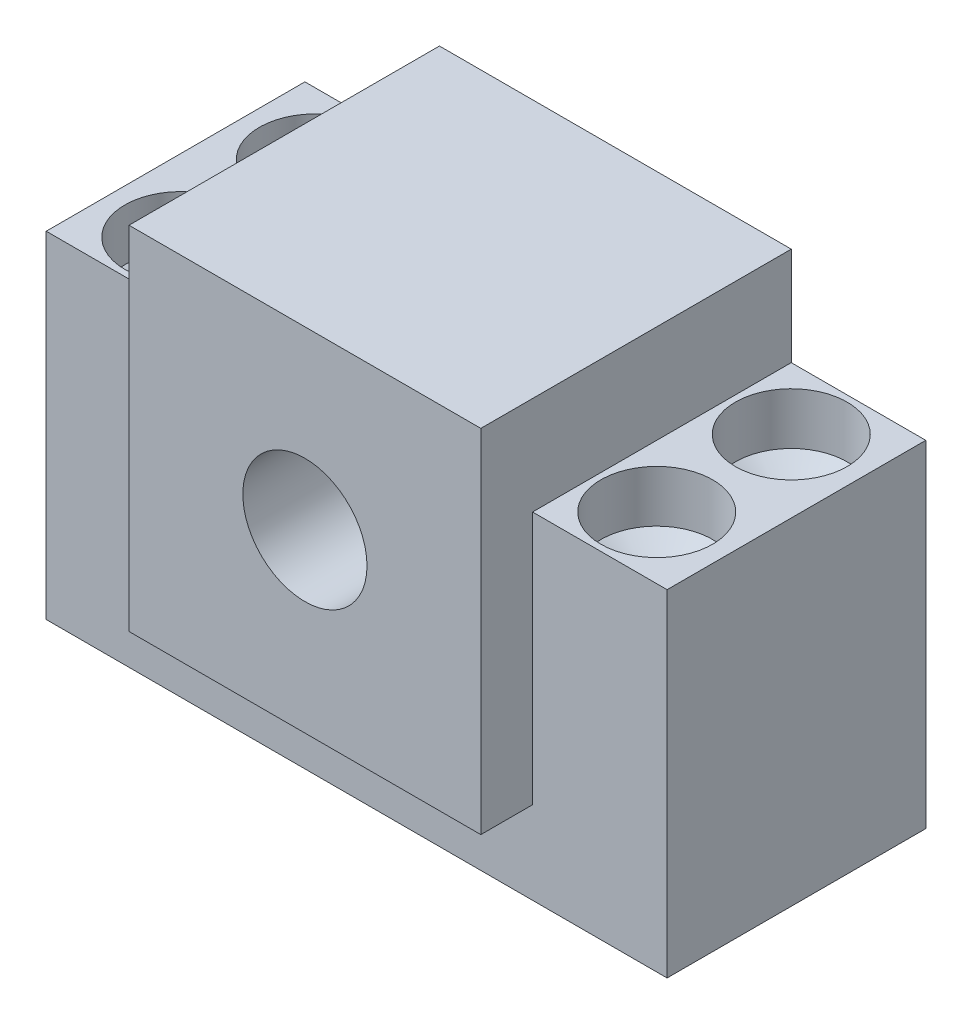
ISO-10303-21;
HEADER;
FILE_DESCRIPTION(('STEP AP214'),'2;1');
FILE_NAME('part.step','',(''),(''),'','','');
FILE_SCHEMA(('AUTOMOTIVE_DESIGN { 1 0 10303 214 1 1 1 1 }'));
ENDSEC;
DATA;
#1=APPLICATION_CONTEXT('core data for automotive mechanical design processes');
#2=APPLICATION_PROTOCOL_DEFINITION('international standard','automotive_design',2000,#1);
#3=PRODUCT_CONTEXT('',#1,'mechanical');
#4=PRODUCT('Part','Part','',(#3));
#5=PRODUCT_RELATED_PRODUCT_CATEGORY('part','',(#4));
#6=PRODUCT_DEFINITION_FORMATION('','',#4);
#7=PRODUCT_DEFINITION_CONTEXT('part definition',#1,'design');
#8=PRODUCT_DEFINITION('design','',#6,#7);
#9=PRODUCT_DEFINITION_SHAPE('','',#8);
#10=(LENGTH_UNIT() NAMED_UNIT(*) SI_UNIT(.MILLI.,.METRE.));
#11=(NAMED_UNIT(*) PLANE_ANGLE_UNIT() SI_UNIT($,.RADIAN.));
#12=(NAMED_UNIT(*) SI_UNIT($,.STERADIAN.) SOLID_ANGLE_UNIT());
#13=UNCERTAINTY_MEASURE_WITH_UNIT(LENGTH_MEASURE(1.E-05),#10,'distance_accuracy_value','');
#14=(GEOMETRIC_REPRESENTATION_CONTEXT(3) GLOBAL_UNCERTAINTY_ASSIGNED_CONTEXT((#13)) GLOBAL_UNIT_ASSIGNED_CONTEXT((#10,
#11,#12)) REPRESENTATION_CONTEXT('',''));
#15=CARTESIAN_POINT('',(0.,0.,0.));
#16=DIRECTION('',(0.,0.,1.));
#17=DIRECTION('',(1.,0.,0.));
#18=AXIS2_PLACEMENT_3D('',#15,#16,#17);
#19=CARTESIAN_POINT('',(0.,16.2499999999999,25.));
#20=DIRECTION('',(0.,1.,0.));
#21=DIRECTION('',(-1.,0.,0.));
#22=AXIS2_PLACEMENT_3D('',#19,#20,#21);
#23=PLANE('',#22);
#24=CARTESIAN_POINT('',(23.0000000000001,16.2499999999999,6.));
#25=DIRECTION('',(0.,1.,0.));
#26=DIRECTION('',(0.,0.,1.));
#27=AXIS2_PLACEMENT_3D('',#24,#25,#26);
#28=CIRCLE('',#27,5.39999999999999);
#29=CARTESIAN_POINT('',(23.0000000000001,16.2499999999999,11.4));
#30=VERTEX_POINT('',#29);
#31=EDGE_CURVE('E207',#30,#30,#28,.T.);
#32=ORIENTED_EDGE('',*,*,#31,.F.);
#33=EDGE_LOOP('',(#32));
#34=FACE_BOUND('',#33,.T.);
#35=CARTESIAN_POINT('',(23.0000000000001,16.2499999999999,19.));
#36=DIRECTION('',(0.,1.,0.));
#37=DIRECTION('',(0.,0.,1.));
#38=AXIS2_PLACEMENT_3D('',#35,#36,#37);
#39=CIRCLE('',#38,5.39999999999999);
#40=CARTESIAN_POINT('',(23.0000000000001,16.2499999999999,24.4));
#41=VERTEX_POINT('',#40);
#42=EDGE_CURVE('E203',#41,#41,#39,.T.);
#43=ORIENTED_EDGE('',*,*,#42,.F.);
#44=EDGE_LOOP('',(#43));
#45=FACE_BOUND('',#44,.T.);
#46=DIRECTION('',(1.,0.,0.));
#47=VECTOR('',#46,1.);
#48=CARTESIAN_POINT('',(0.,16.2499999999999,0.));
#49=LINE('',#48,#47);
#50=CARTESIAN_POINT('',(17.0000000000001,16.2499999999999,0.));
#51=VERTEX_POINT('',#50);
#52=CARTESIAN_POINT('',(30.0000000000001,16.2499999999999,0.));
#53=VERTEX_POINT('',#52);
#54=EDGE_CURVE('E129',#51,#53,#49,.T.);
#55=ORIENTED_EDGE('',*,*,#54,.F.);
#56=DIRECTION('',(0.,0.,-1.));
#57=VECTOR('',#56,1.);
#58=CARTESIAN_POINT('',(17.0000000000001,16.2499999999999,25.));
#59=LINE('',#58,#57);
#60=CARTESIAN_POINT('',(17.0000000000001,16.2499999999999,25.));
#61=VERTEX_POINT('',#60);
#62=EDGE_CURVE('E11',#61,#51,#59,.T.);
#63=ORIENTED_EDGE('',*,*,#62,.F.);
#64=DIRECTION('',(1.,0.,0.));
#65=VECTOR('',#64,1.);
#66=CARTESIAN_POINT('',(0.,16.2499999999999,25.));
#67=LINE('',#66,#65);
#68=CARTESIAN_POINT('',(30.0000000000001,16.2499999999999,25.));
#69=VERTEX_POINT('',#68);
#70=EDGE_CURVE('E160',#61,#69,#67,.T.);
#71=ORIENTED_EDGE('',*,*,#70,.T.);
#72=DIRECTION('',(0.,0.,-1.));
#73=VECTOR('',#72,1.);
#74=CARTESIAN_POINT('',(30.0000000000001,16.2499999999999,25.));
#75=LINE('',#74,#73);
#76=EDGE_CURVE('E51',#69,#53,#75,.T.);
#77=ORIENTED_EDGE('',*,*,#76,.T.);
#78=EDGE_LOOP('',(#55,#63,#71,#77));
#79=FACE_BOUND('',#78,.T.);
#80=ADVANCED_FACE('F33',(#34,#45,#79),#23,.T.);
#81=CARTESIAN_POINT('',(0.,16.2499999999999,25.));
#82=DIRECTION('',(0.,1.,0.));
#83=DIRECTION('',(-1.,0.,0.));
#84=AXIS2_PLACEMENT_3D('',#81,#82,#83);
#85=PLANE('',#84);
#86=CARTESIAN_POINT('',(-22.9999999999999,16.2499999999999,19.));
#87=DIRECTION('',(0.,1.,0.));
#88=DIRECTION('',(0.,0.,1.));
#89=AXIS2_PLACEMENT_3D('',#86,#87,#88);
#90=CIRCLE('',#89,5.39999999999999);
#91=CARTESIAN_POINT('',(-22.9999999999999,16.2499999999999,24.4));
#92=VERTEX_POINT('',#91);
#93=EDGE_CURVE('E443',#92,#92,#90,.T.);
#94=ORIENTED_EDGE('',*,*,#93,.F.);
#95=EDGE_LOOP('',(#94));
#96=FACE_BOUND('',#95,.T.);
#97=CARTESIAN_POINT('',(-22.9999999999999,16.2499999999999,6.));
#98=DIRECTION('',(0.,1.,0.));
#99=DIRECTION('',(0.,0.,1.));
#100=AXIS2_PLACEMENT_3D('',#97,#98,#99);
#101=CIRCLE('',#100,5.39999999999999);
#102=CARTESIAN_POINT('',(-22.9999999999999,16.2499999999999,11.4));
#103=VERTEX_POINT('',#102);
#104=EDGE_CURVE('E214',#103,#103,#101,.T.);
#105=ORIENTED_EDGE('',*,*,#104,.F.);
#106=EDGE_LOOP('',(#105));
#107=FACE_BOUND('',#106,.T.);
#108=DIRECTION('',(1.,0.,0.));
#109=VECTOR('',#108,1.);
#110=CARTESIAN_POINT('',(0.,16.2499999999999,0.));
#111=LINE('',#110,#109);
#112=CARTESIAN_POINT('',(-29.9999999999999,16.2499999999999,0.));
#113=VERTEX_POINT('',#112);
#114=CARTESIAN_POINT('',(-16.9999999999999,16.2499999999999,0.));
#115=VERTEX_POINT('',#114);
#116=EDGE_CURVE('E179',#113,#115,#111,.T.);
#117=ORIENTED_EDGE('',*,*,#116,.F.);
#118=DIRECTION('',(0.,0.,-1.));
#119=VECTOR('',#118,1.);
#120=CARTESIAN_POINT('',(-29.9999999999999,16.2499999999999,25.));
#121=LINE('',#120,#119);
#122=CARTESIAN_POINT('',(-29.9999999999999,16.2499999999999,25.));
#123=VERTEX_POINT('',#122);
#124=EDGE_CURVE('E78',#123,#113,#121,.T.);
#125=ORIENTED_EDGE('',*,*,#124,.F.);
#126=DIRECTION('',(1.,0.,0.));
#127=VECTOR('',#126,1.);
#128=CARTESIAN_POINT('',(0.,16.2499999999999,25.));
#129=LINE('',#128,#127);
#130=CARTESIAN_POINT('',(-16.9999999999999,16.2499999999999,25.));
#131=VERTEX_POINT('',#130);
#132=EDGE_CURVE('E170',#123,#131,#129,.T.);
#133=ORIENTED_EDGE('',*,*,#132,.T.);
#134=DIRECTION('',(0.,0.,-1.));
#135=VECTOR('',#134,1.);
#136=CARTESIAN_POINT('',(-16.9999999999999,16.2499999999999,25.));
#137=LINE('',#136,#135);
#138=EDGE_CURVE('E42',#131,#115,#137,.T.);
#139=ORIENTED_EDGE('',*,*,#138,.T.);
#140=EDGE_LOOP('',(#117,#125,#133,#139));
#141=FACE_BOUND('',#140,.T.);
#142=ADVANCED_FACE('F263',(#96,#107,#141),#85,.T.);
#143=CARTESIAN_POINT('',(-29.9999999999999,0.,25.));
#144=DIRECTION('',(1.,0.,0.));
#145=DIRECTION('',(0.,1.,0.));
#146=AXIS2_PLACEMENT_3D('',#143,#144,#145);
#147=PLANE('',#146);
#148=DIRECTION('',(0.,-1.,0.));
#149=VECTOR('',#148,1.);
#150=CARTESIAN_POINT('',(-29.9999999999999,0.,0.));
#151=LINE('',#150,#149);
#152=CARTESIAN_POINT('',(-29.9999999999999,-16.2500000000001,0.));
#153=VERTEX_POINT('',#152);
#154=EDGE_CURVE('E182',#113,#153,#151,.T.);
#155=ORIENTED_EDGE('',*,*,#154,.T.);
#156=DIRECTION('',(0.,0.,-1.));
#157=VECTOR('',#156,1.);
#158=CARTESIAN_POINT('',(-29.9999999999999,-16.2500000000001,25.));
#159=LINE('',#158,#157);
#160=CARTESIAN_POINT('',(-29.9999999999999,-16.2500000000001,25.));
#161=VERTEX_POINT('',#160);
#162=EDGE_CURVE('E190',#161,#153,#159,.T.);
#163=ORIENTED_EDGE('',*,*,#162,.F.);
#164=DIRECTION('',(0.,-1.,0.));
#165=VECTOR('',#164,1.);
#166=CARTESIAN_POINT('',(-29.9999999999999,0.,25.));
#167=LINE('',#166,#165);
#168=EDGE_CURVE('E172',#123,#161,#167,.T.);
#169=ORIENTED_EDGE('',*,*,#168,.F.);
#170=ORIENTED_EDGE('',*,*,#124,.T.);
#171=EDGE_LOOP('',(#155,#163,#169,#170));
#172=FACE_BOUND('',#171,.T.);
#173=ADVANCED_FACE('F268',(#172),#147,.F.);
#174=CARTESIAN_POINT('',(0.,-16.2500000000001,25.));
#175=DIRECTION('',(0.,1.,0.));
#176=DIRECTION('',(0.,0.,1.));
#177=AXIS2_PLACEMENT_3D('',#174,#175,#176);
#178=PLANE('',#177);
#179=CARTESIAN_POINT('',(-22.9999999999999,-16.2500000000001,19.));
#180=DIRECTION('',(0.,1.,0.));
#181=DIRECTION('',(0.,0.,1.));
#182=AXIS2_PLACEMENT_3D('',#179,#180,#181);
#183=CIRCLE('',#182,3.29999999999999);
#184=CARTESIAN_POINT('',(-22.9999999999999,-16.2500000000001,22.3));
#185=VERTEX_POINT('',#184);
#186=EDGE_CURVE('E231',#185,#185,#183,.T.);
#187=ORIENTED_EDGE('',*,*,#186,.T.);
#188=EDGE_LOOP('',(#187));
#189=FACE_BOUND('',#188,.T.);
#190=CARTESIAN_POINT('',(-22.9999999999999,-16.2500000000001,6.));
#191=DIRECTION('',(0.,1.,0.));
#192=DIRECTION('',(0.,0.,1.));
#193=AXIS2_PLACEMENT_3D('',#190,#191,#192);
#194=CIRCLE('',#193,3.29999999999999);
#195=CARTESIAN_POINT('',(-22.9999999999999,-16.2500000000001,9.3));
#196=VERTEX_POINT('',#195);
#197=EDGE_CURVE('E236',#196,#196,#194,.T.);
#198=ORIENTED_EDGE('',*,*,#197,.T.);
#199=EDGE_LOOP('',(#198));
#200=FACE_BOUND('',#199,.T.);
#201=CARTESIAN_POINT('',(23.0000000000001,-16.2500000000001,6.));
#202=DIRECTION('',(0.,1.,0.));
#203=DIRECTION('',(0.,0.,1.));
#204=AXIS2_PLACEMENT_3D('',#201,#202,#203);
#205=CIRCLE('',#204,3.29999999999999);
#206=CARTESIAN_POINT('',(23.0000000000001,-16.2500000000001,9.29999999999999));
#207=VERTEX_POINT('',#206);
#208=EDGE_CURVE('E239',#207,#207,#205,.T.);
#209=ORIENTED_EDGE('',*,*,#208,.T.);
#210=EDGE_LOOP('',(#209));
#211=FACE_BOUND('',#210,.T.);
#212=CARTESIAN_POINT('',(23.0000000000001,-16.2500000000001,19.));
#213=DIRECTION('',(0.,1.,0.));
#214=DIRECTION('',(0.,0.,1.));
#215=AXIS2_PLACEMENT_3D('',#212,#213,#214);
#216=CIRCLE('',#215,3.29999999999999);
#217=CARTESIAN_POINT('',(23.0000000000001,-16.2500000000001,22.3));
#218=VERTEX_POINT('',#217);
#219=EDGE_CURVE('E152',#218,#218,#216,.T.);
#220=ORIENTED_EDGE('',*,*,#219,.T.);
#221=EDGE_LOOP('',(#220));
#222=FACE_BOUND('',#221,.T.);
#223=DIRECTION('',(1.,0.,0.));
#224=VECTOR('',#223,1.);
#225=CARTESIAN_POINT('',(0.,-16.2500000000001,0.));
#226=LINE('',#225,#224);
#227=CARTESIAN_POINT('',(30.0000000000001,-16.2500000000001,0.));
#228=VERTEX_POINT('',#227);
#229=EDGE_CURVE('E184',#153,#228,#226,.T.);
#230=ORIENTED_EDGE('',*,*,#229,.T.);
#231=DIRECTION('',(0.,0.,-1.));
#232=VECTOR('',#231,1.);
#233=CARTESIAN_POINT('',(30.0000000000001,-16.2500000000001,25.));
#234=LINE('',#233,#232);
#235=CARTESIAN_POINT('',(30.0000000000001,-16.2500000000001,25.));
#236=VERTEX_POINT('',#235);
#237=EDGE_CURVE('E67',#236,#228,#234,.T.);
#238=ORIENTED_EDGE('',*,*,#237,.F.);
#239=DIRECTION('',(1.,0.,0.));
#240=VECTOR('',#239,1.);
#241=CARTESIAN_POINT('',(0.,-16.2500000000001,25.));
#242=LINE('',#241,#240);
#243=EDGE_CURVE('E174',#161,#236,#242,.T.);
#244=ORIENTED_EDGE('',*,*,#243,.F.);
#245=ORIENTED_EDGE('',*,*,#162,.T.);
#246=EDGE_LOOP('',(#230,#238,#244,#245));
#247=FACE_BOUND('',#246,.T.);
#248=ADVANCED_FACE('F244',(#189,#200,#211,#222,#247),#178,.F.);
#249=CARTESIAN_POINT('',(30.0000000000001,0.,25.));
#250=DIRECTION('',(1.,0.,0.));
#251=DIRECTION('',(0.,0.,-1.));
#252=AXIS2_PLACEMENT_3D('',#249,#250,#251);
#253=PLANE('',#252);
#254=DIRECTION('',(0.,-1.,0.));
#255=VECTOR('',#254,1.);
#256=CARTESIAN_POINT('',(30.0000000000001,0.,0.));
#257=LINE('',#256,#255);
#258=EDGE_CURVE('E163',#53,#228,#257,.T.);
#259=ORIENTED_EDGE('',*,*,#258,.F.);
#260=ORIENTED_EDGE('',*,*,#76,.F.);
#261=DIRECTION('',(0.,-1.,0.));
#262=VECTOR('',#261,1.);
#263=CARTESIAN_POINT('',(30.0000000000001,0.,25.));
#264=LINE('',#263,#262);
#265=EDGE_CURVE('E176',#69,#236,#264,.T.);
#266=ORIENTED_EDGE('',*,*,#265,.T.);
#267=ORIENTED_EDGE('',*,*,#237,.T.);
#268=EDGE_LOOP('',(#259,#260,#266,#267));
#269=FACE_BOUND('',#268,.T.);
#270=ADVANCED_FACE('F278',(#269),#253,.T.);
#271=CARTESIAN_POINT('',(0.,0.,25.));
#272=DIRECTION('',(0.,0.,1.));
#273=DIRECTION('',(1.,0.,0.));
#274=AXIS2_PLACEMENT_3D('',#271,#272,#273);
#275=PLANE('',#274);
#276=ORIENTED_EDGE('',*,*,#70,.F.);
#277=DIRECTION('',(0.,-1.,0.));
#278=VECTOR('',#277,1.);
#279=CARTESIAN_POINT('',(17.0000000000001,0.,25.));
#280=LINE('',#279,#278);
#281=CARTESIAN_POINT('',(17.0000000000001,-8.2500000000001,25.));
#282=VERTEX_POINT('',#281);
#283=EDGE_CURVE('E162',#61,#282,#280,.T.);
#284=ORIENTED_EDGE('',*,*,#283,.T.);
#285=DIRECTION('',(1.,0.,0.));
#286=VECTOR('',#285,1.);
#287=CARTESIAN_POINT('',(0.,-8.2500000000001,25.));
#288=LINE('',#287,#286);
#289=CARTESIAN_POINT('',(-16.9999999999999,-8.2500000000001,25.));
#290=VERTEX_POINT('',#289);
#291=EDGE_CURVE('E166',#290,#282,#288,.T.);
#292=ORIENTED_EDGE('',*,*,#291,.F.);
#293=DIRECTION('',(0.,-1.,0.));
#294=VECTOR('',#293,1.);
#295=CARTESIAN_POINT('',(-16.9999999999999,0.,25.));
#296=LINE('',#295,#294);
#297=EDGE_CURVE('E168',#131,#290,#296,.T.);
#298=ORIENTED_EDGE('',*,*,#297,.F.);
#299=ORIENTED_EDGE('',*,*,#132,.F.);
#300=ORIENTED_EDGE('',*,*,#168,.T.);
#301=ORIENTED_EDGE('',*,*,#243,.T.);
#302=ORIENTED_EDGE('',*,*,#265,.F.);
#303=EDGE_LOOP('',(#276,#284,#292,#298,#299,#300,#301,#302));
#304=FACE_BOUND('',#303,.T.);
#305=ADVANCED_FACE('F280',(#304),#275,.T.);
#306=CARTESIAN_POINT('',(0.,0.,0.));
#307=DIRECTION('',(0.,0.,1.));
#308=DIRECTION('',(1.,0.,0.));
#309=AXIS2_PLACEMENT_3D('',#306,#307,#308);
#310=PLANE('',#309);
#311=CARTESIAN_POINT('',(0.,8.7499999999999,0.));
#312=DIRECTION('',(0.,0.,1.));
#313=DIRECTION('',(1.,0.,0.));
#314=AXIS2_PLACEMENT_3D('',#311,#312,#313);
#315=CIRCLE('',#314,6.);
#316=CARTESIAN_POINT('',(6.,8.7499999999999,0.));
#317=VERTEX_POINT('',#316);
#318=EDGE_CURVE('E228',#317,#317,#315,.T.);
#319=ORIENTED_EDGE('',*,*,#318,.T.);
#320=EDGE_LOOP('',(#319));
#321=FACE_BOUND('',#320,.T.);
#322=ORIENTED_EDGE('',*,*,#54,.T.);
#323=ORIENTED_EDGE('',*,*,#258,.T.);
#324=ORIENTED_EDGE('',*,*,#229,.F.);
#325=ORIENTED_EDGE('',*,*,#154,.F.);
#326=ORIENTED_EDGE('',*,*,#116,.T.);
#327=DIRECTION('',(0.,-1.,0.));
#328=VECTOR('',#327,1.);
#329=CARTESIAN_POINT('',(-16.9999999999999,0.,0.));
#330=LINE('',#329,#328);
#331=CARTESIAN_POINT('',(-16.9999999999999,25.7499999999999,0.));
#332=VERTEX_POINT('',#331);
#333=EDGE_CURVE('E139',#332,#115,#330,.T.);
#334=ORIENTED_EDGE('',*,*,#333,.F.);
#335=DIRECTION('',(1.,0.,0.));
#336=VECTOR('',#335,1.);
#337=CARTESIAN_POINT('',(0.,25.7499999999999,0.));
#338=LINE('',#337,#336);
#339=CARTESIAN_POINT('',(17.0000000000001,25.7499999999999,0.));
#340=VERTEX_POINT('',#339);
#341=EDGE_CURVE('E151',#332,#340,#338,.T.);
#342=ORIENTED_EDGE('',*,*,#341,.T.);
#343=DIRECTION('',(0.,-1.,0.));
#344=VECTOR('',#343,1.);
#345=CARTESIAN_POINT('',(17.0000000000001,0.,0.));
#346=LINE('',#345,#344);
#347=EDGE_CURVE('E124',#340,#51,#346,.T.);
#348=ORIENTED_EDGE('',*,*,#347,.T.);
#349=EDGE_LOOP('',(#322,#323,#324,#325,#326,#334,#342,#348));
#350=FACE_BOUND('',#349,.T.);
#351=ADVANCED_FACE('F276',(#321,#350),#310,.F.);
#352=CARTESIAN_POINT('',(17.0000000000001,0.,30.));
#353=DIRECTION('',(1.,0.,0.));
#354=DIRECTION('',(0.,1.,0.));
#355=AXIS2_PLACEMENT_3D('',#352,#353,#354);
#356=PLANE('',#355);
#357=ORIENTED_EDGE('',*,*,#283,.F.);
#358=ORIENTED_EDGE('',*,*,#62,.T.);
#359=ORIENTED_EDGE('',*,*,#347,.F.);
#360=DIRECTION('',(0.,0.,-1.));
#361=VECTOR('',#360,1.);
#362=CARTESIAN_POINT('',(17.0000000000001,25.7499999999999,30.));
#363=LINE('',#362,#361);
#364=CARTESIAN_POINT('',(17.0000000000001,25.7499999999999,30.));
#365=VERTEX_POINT('',#364);
#366=EDGE_CURVE('E118',#365,#340,#363,.T.);
#367=ORIENTED_EDGE('',*,*,#366,.F.);
#368=DIRECTION('',(0.,-1.,0.));
#369=VECTOR('',#368,1.);
#370=CARTESIAN_POINT('',(17.0000000000001,0.,30.));
#371=LINE('',#370,#369);
#372=CARTESIAN_POINT('',(17.0000000000001,-8.2500000000001,30.));
#373=VERTEX_POINT('',#372);
#374=EDGE_CURVE('E122',#365,#373,#371,.T.);
#375=ORIENTED_EDGE('',*,*,#374,.T.);
#376=DIRECTION('',(0.,0.,-1.));
#377=VECTOR('',#376,1.);
#378=CARTESIAN_POINT('',(17.0000000000001,-8.2500000000001,30.));
#379=LINE('',#378,#377);
#380=EDGE_CURVE('E149',#373,#282,#379,.T.);
#381=ORIENTED_EDGE('',*,*,#380,.T.);
#382=EDGE_LOOP('',(#357,#358,#359,#367,#375,#381));
#383=FACE_BOUND('',#382,.T.);
#384=ADVANCED_FACE('F120',(#383),#356,.T.);
#385=CARTESIAN_POINT('',(0.,25.7499999999999,30.));
#386=DIRECTION('',(0.,1.,0.));
#387=DIRECTION('',(0.,0.,1.));
#388=AXIS2_PLACEMENT_3D('',#385,#386,#387);
#389=PLANE('',#388);
#390=ORIENTED_EDGE('',*,*,#341,.F.);
#391=DIRECTION('',(0.,0.,-1.));
#392=VECTOR('',#391,1.);
#393=CARTESIAN_POINT('',(-16.9999999999999,25.7499999999999,30.));
#394=LINE('',#393,#392);
#395=CARTESIAN_POINT('',(-16.9999999999999,25.7499999999999,30.));
#396=VERTEX_POINT('',#395);
#397=EDGE_CURVE('E130',#396,#332,#394,.T.);
#398=ORIENTED_EDGE('',*,*,#397,.F.);
#399=DIRECTION('',(1.,0.,0.));
#400=VECTOR('',#399,1.);
#401=CARTESIAN_POINT('',(0.,25.7499999999999,30.));
#402=LINE('',#401,#400);
#403=EDGE_CURVE('E135',#396,#365,#402,.T.);
#404=ORIENTED_EDGE('',*,*,#403,.T.);
#405=ORIENTED_EDGE('',*,*,#366,.T.);
#406=EDGE_LOOP('',(#390,#398,#404,#405));
#407=FACE_BOUND('',#406,.T.);
#408=ADVANCED_FACE('F141',(#407),#389,.T.);
#409=CARTESIAN_POINT('',(-16.9999999999999,0.,30.));
#410=DIRECTION('',(1.,0.,0.));
#411=DIRECTION('',(0.,1.,0.));
#412=AXIS2_PLACEMENT_3D('',#409,#410,#411);
#413=PLANE('',#412);
#414=ORIENTED_EDGE('',*,*,#138,.F.);
#415=ORIENTED_EDGE('',*,*,#297,.T.);
#416=DIRECTION('',(0.,0.,-1.));
#417=VECTOR('',#416,1.);
#418=CARTESIAN_POINT('',(-16.9999999999999,-8.2500000000001,30.));
#419=LINE('',#418,#417);
#420=CARTESIAN_POINT('',(-16.9999999999999,-8.2500000000001,30.));
#421=VERTEX_POINT('',#420);
#422=EDGE_CURVE('E156',#421,#290,#419,.T.);
#423=ORIENTED_EDGE('',*,*,#422,.F.);
#424=DIRECTION('',(0.,-1.,0.));
#425=VECTOR('',#424,1.);
#426=CARTESIAN_POINT('',(-16.9999999999999,0.,30.));
#427=LINE('',#426,#425);
#428=EDGE_CURVE('E143',#396,#421,#427,.T.);
#429=ORIENTED_EDGE('',*,*,#428,.F.);
#430=ORIENTED_EDGE('',*,*,#397,.T.);
#431=ORIENTED_EDGE('',*,*,#333,.T.);
#432=EDGE_LOOP('',(#414,#415,#423,#429,#430,#431));
#433=FACE_BOUND('',#432,.T.);
#434=ADVANCED_FACE('F305',(#433),#413,.F.);
#435=CARTESIAN_POINT('',(0.,-8.2500000000001,30.));
#436=DIRECTION('',(0.,1.,0.));
#437=DIRECTION('',(0.,0.,1.));
#438=AXIS2_PLACEMENT_3D('',#435,#436,#437);
#439=PLANE('',#438);
#440=ORIENTED_EDGE('',*,*,#291,.T.);
#441=ORIENTED_EDGE('',*,*,#380,.F.);
#442=DIRECTION('',(1.,0.,0.));
#443=VECTOR('',#442,1.);
#444=CARTESIAN_POINT('',(0.,-8.2500000000001,30.));
#445=LINE('',#444,#443);
#446=EDGE_CURVE('E137',#421,#373,#445,.T.);
#447=ORIENTED_EDGE('',*,*,#446,.F.);
#448=ORIENTED_EDGE('',*,*,#422,.T.);
#449=EDGE_LOOP('',(#440,#441,#447,#448));
#450=FACE_BOUND('',#449,.T.);
#451=ADVANCED_FACE('F259',(#450),#439,.F.);
#452=CARTESIAN_POINT('',(0.,0.,30.));
#453=DIRECTION('',(0.,0.,1.));
#454=DIRECTION('',(1.,0.,0.));
#455=AXIS2_PLACEMENT_3D('',#452,#453,#454);
#456=PLANE('',#455);
#457=CARTESIAN_POINT('',(0.,8.7499999999999,30.));
#458=DIRECTION('',(0.,0.,1.));
#459=DIRECTION('',(1.,0.,0.));
#460=AXIS2_PLACEMENT_3D('',#457,#458,#459);
#461=CIRCLE('',#460,6.);
#462=CARTESIAN_POINT('',(6.,8.7499999999999,30.));
#463=VERTEX_POINT('',#462);
#464=EDGE_CURVE('E199',#463,#463,#461,.T.);
#465=ORIENTED_EDGE('',*,*,#464,.F.);
#466=EDGE_LOOP('',(#465));
#467=FACE_BOUND('',#466,.T.);
#468=ORIENTED_EDGE('',*,*,#374,.F.);
#469=ORIENTED_EDGE('',*,*,#403,.F.);
#470=ORIENTED_EDGE('',*,*,#428,.T.);
#471=ORIENTED_EDGE('',*,*,#446,.T.);
#472=EDGE_LOOP('',(#468,#469,#470,#471));
#473=FACE_BOUND('',#472,.T.);
#474=ADVANCED_FACE('F134',(#467,#473),#456,.T.);
#475=CARTESIAN_POINT('',(23.0000000000001,16.2499999999999,19.));
#476=DIRECTION('',(0.,1.,0.));
#477=DIRECTION('',(0.,0.,1.));
#478=AXIS2_PLACEMENT_3D('',#475,#476,#477);
#479=CYLINDRICAL_SURFACE('',#478,3.3);
#480=CARTESIAN_POINT('',(23.0000000000001,9.98819270004202,19.));
#481=DIRECTION('',(0.,1.,0.));
#482=DIRECTION('',(0.,0.,1.));
#483=AXIS2_PLACEMENT_3D('',#480,#481,#482);
#484=CIRCLE('',#483,3.3);
#485=CARTESIAN_POINT('',(23.0000000000001,9.98819270004202,22.3));
#486=VERTEX_POINT('',#485);
#487=EDGE_CURVE('E196',#486,#486,#484,.T.);
#488=ORIENTED_EDGE('',*,*,#487,.T.);
#489=EDGE_LOOP('',(#488));
#490=FACE_BOUND('',#489,.T.);
#491=ORIENTED_EDGE('',*,*,#219,.F.);
#492=EDGE_LOOP('',(#491));
#493=FACE_BOUND('',#492,.T.);
#494=ADVANCED_FACE('F247',(#490,#493),#479,.F.);
#495=CARTESIAN_POINT('',(23.0000000000001,16.2499999999999,6.));
#496=DIRECTION('',(0.,1.,0.));
#497=DIRECTION('',(0.,0.,1.));
#498=AXIS2_PLACEMENT_3D('',#495,#496,#497);
#499=CYLINDRICAL_SURFACE('',#498,3.3);
#500=CARTESIAN_POINT('',(23.0000000000001,9.98819270004202,6.));
#501=DIRECTION('',(0.,1.,0.));
#502=DIRECTION('',(0.,0.,1.));
#503=AXIS2_PLACEMENT_3D('',#500,#501,#502);
#504=CIRCLE('',#503,3.3);
#505=CARTESIAN_POINT('',(23.0000000000001,9.98819270004202,9.3));
#506=VERTEX_POINT('',#505);
#507=EDGE_CURVE('E201',#506,#506,#504,.T.);
#508=ORIENTED_EDGE('',*,*,#507,.T.);
#509=EDGE_LOOP('',(#508));
#510=FACE_BOUND('',#509,.T.);
#511=ORIENTED_EDGE('',*,*,#208,.F.);
#512=EDGE_LOOP('',(#511));
#513=FACE_BOUND('',#512,.T.);
#514=ADVANCED_FACE('F249',(#510,#513),#499,.F.);
#515=CARTESIAN_POINT('',(-22.9999999999999,16.2499999999999,6.));
#516=DIRECTION('',(0.,1.,0.));
#517=DIRECTION('',(0.,0.,1.));
#518=AXIS2_PLACEMENT_3D('',#515,#516,#517);
#519=CYLINDRICAL_SURFACE('',#518,3.3);
#520=CARTESIAN_POINT('',(-22.9999999999999,9.98819270004205,6.));
#521=DIRECTION('',(0.,1.,0.));
#522=DIRECTION('',(0.,0.,1.));
#523=AXIS2_PLACEMENT_3D('',#520,#521,#522);
#524=CIRCLE('',#523,3.3);
#525=CARTESIAN_POINT('',(-22.9999999999999,9.98819270004205,9.3));
#526=VERTEX_POINT('',#525);
#527=EDGE_CURVE('E205',#526,#526,#524,.T.);
#528=ORIENTED_EDGE('',*,*,#527,.T.);
#529=EDGE_LOOP('',(#528));
#530=FACE_BOUND('',#529,.T.);
#531=ORIENTED_EDGE('',*,*,#197,.F.);
#532=EDGE_LOOP('',(#531));
#533=FACE_BOUND('',#532,.T.);
#534=ADVANCED_FACE('F256',(#530,#533),#519,.F.);
#535=CARTESIAN_POINT('',(-22.9999999999999,16.2499999999999,19.));
#536=DIRECTION('',(0.,1.,0.));
#537=DIRECTION('',(0.,0.,1.));
#538=AXIS2_PLACEMENT_3D('',#535,#536,#537);
#539=CYLINDRICAL_SURFACE('',#538,3.3);
#540=CARTESIAN_POINT('',(-22.9999999999999,9.98819270004205,19.));
#541=DIRECTION('',(0.,1.,0.));
#542=DIRECTION('',(0.,0.,1.));
#543=AXIS2_PLACEMENT_3D('',#540,#541,#542);
#544=CIRCLE('',#543,3.3);
#545=CARTESIAN_POINT('',(-22.9999999999999,9.98819270004205,22.3));
#546=VERTEX_POINT('',#545);
#547=EDGE_CURVE('E36',#546,#546,#544,.T.);
#548=ORIENTED_EDGE('',*,*,#547,.T.);
#549=EDGE_LOOP('',(#548));
#550=FACE_BOUND('',#549,.T.);
#551=ORIENTED_EDGE('',*,*,#186,.F.);
#552=EDGE_LOOP('',(#551));
#553=FACE_BOUND('',#552,.T.);
#554=ADVANCED_FACE('F330',(#550,#553),#539,.F.);
#555=CARTESIAN_POINT('',(0.,8.7499999999999,0.));
#556=DIRECTION('',(0.,0.,1.));
#557=DIRECTION('',(1.,0.,0.));
#558=AXIS2_PLACEMENT_3D('',#555,#556,#557);
#559=CYLINDRICAL_SURFACE('',#558,6.);
#560=ORIENTED_EDGE('',*,*,#318,.F.);
#561=EDGE_LOOP('',(#560));
#562=FACE_BOUND('',#561,.T.);
#563=ORIENTED_EDGE('',*,*,#464,.T.);
#564=EDGE_LOOP('',(#563));
#565=FACE_BOUND('',#564,.T.);
#566=ADVANCED_FACE('F326',(#562,#565),#559,.F.);
#567=CARTESIAN_POINT('',(23.0000000000001,11.2499999999999,19.));
#568=DIRECTION('',(0.,1.,0.));
#569=DIRECTION('',(0.,0.,1.));
#570=AXIS2_PLACEMENT_3D('',#567,#568,#569);
#571=CONICAL_SURFACE('',#570,5.4,1.02974425867665);
#572=CARTESIAN_POINT('',(23.0000000000001,11.2499999999999,19.));
#573=DIRECTION('',(0.,1.,0.));
#574=DIRECTION('',(0.,0.,1.));
#575=AXIS2_PLACEMENT_3D('',#572,#573,#574);
#576=CIRCLE('',#575,5.4);
#577=CARTESIAN_POINT('',(23.0000000000001,11.2499999999999,24.4));
#578=VERTEX_POINT('',#577);
#579=EDGE_CURVE('E200',#578,#578,#576,.T.);
#580=ORIENTED_EDGE('',*,*,#579,.T.);
#581=EDGE_LOOP('',(#580));
#582=FACE_BOUND('',#581,.T.);
#583=ORIENTED_EDGE('',*,*,#487,.F.);
#584=EDGE_LOOP('',(#583));
#585=FACE_BOUND('',#584,.T.);
#586=ADVANCED_FACE('F329',(#582,#585),#571,.F.);
#587=CARTESIAN_POINT('',(23.0000000000001,16.2499999999999,19.));
#588=DIRECTION('',(0.,1.,0.));
#589=DIRECTION('',(0.,0.,1.));
#590=AXIS2_PLACEMENT_3D('',#587,#588,#589);
#591=CYLINDRICAL_SURFACE('',#590,5.39999999999999);
#592=ORIENTED_EDGE('',*,*,#579,.F.);
#593=EDGE_LOOP('',(#592));
#594=FACE_BOUND('',#593,.T.);
#595=ORIENTED_EDGE('',*,*,#42,.T.);
#596=EDGE_LOOP('',(#595));
#597=FACE_BOUND('',#596,.T.);
#598=ADVANCED_FACE('F337',(#594,#597),#591,.F.);
#599=CARTESIAN_POINT('',(23.0000000000001,11.2499999999999,6.));
#600=DIRECTION('',(0.,1.,0.));
#601=DIRECTION('',(0.,0.,1.));
#602=AXIS2_PLACEMENT_3D('',#599,#600,#601);
#603=CONICAL_SURFACE('',#602,5.4,1.02974425867665);
#604=CARTESIAN_POINT('',(23.0000000000001,11.2499999999999,6.));
#605=DIRECTION('',(0.,1.,0.));
#606=DIRECTION('',(0.,0.,1.));
#607=AXIS2_PLACEMENT_3D('',#604,#605,#606);
#608=CIRCLE('',#607,5.4);
#609=CARTESIAN_POINT('',(23.0000000000001,11.2499999999999,11.4));
#610=VERTEX_POINT('',#609);
#611=EDGE_CURVE('E204',#610,#610,#608,.T.);
#612=ORIENTED_EDGE('',*,*,#611,.T.);
#613=EDGE_LOOP('',(#612));
#614=FACE_BOUND('',#613,.T.);
#615=ORIENTED_EDGE('',*,*,#507,.F.);
#616=EDGE_LOOP('',(#615));
#617=FACE_BOUND('',#616,.T.);
#618=ADVANCED_FACE('F375',(#614,#617),#603,.F.);
#619=CARTESIAN_POINT('',(23.0000000000001,16.2499999999999,6.));
#620=DIRECTION('',(0.,1.,0.));
#621=DIRECTION('',(0.,0.,1.));
#622=AXIS2_PLACEMENT_3D('',#619,#620,#621);
#623=CYLINDRICAL_SURFACE('',#622,5.39999999999999);
#624=ORIENTED_EDGE('',*,*,#611,.F.);
#625=EDGE_LOOP('',(#624));
#626=FACE_BOUND('',#625,.T.);
#627=ORIENTED_EDGE('',*,*,#31,.T.);
#628=EDGE_LOOP('',(#627));
#629=FACE_BOUND('',#628,.T.);
#630=ADVANCED_FACE('F384',(#626,#629),#623,.F.);
#631=CARTESIAN_POINT('',(-22.9999999999999,11.2499999999999,6.));
#632=DIRECTION('',(0.,1.,0.));
#633=DIRECTION('',(0.,0.,1.));
#634=AXIS2_PLACEMENT_3D('',#631,#632,#633);
#635=CONICAL_SURFACE('',#634,5.4,1.02974425867665);
#636=CARTESIAN_POINT('',(-22.9999999999999,11.2499999999999,6.));
#637=DIRECTION('',(0.,1.,0.));
#638=DIRECTION('',(0.,0.,1.));
#639=AXIS2_PLACEMENT_3D('',#636,#637,#638);
#640=CIRCLE('',#639,5.4);
#641=CARTESIAN_POINT('',(-22.9999999999999,11.2499999999999,11.4));
#642=VERTEX_POINT('',#641);
#643=EDGE_CURVE('E208',#642,#642,#640,.T.);
#644=ORIENTED_EDGE('',*,*,#643,.T.);
#645=EDGE_LOOP('',(#644));
#646=FACE_BOUND('',#645,.T.);
#647=ORIENTED_EDGE('',*,*,#527,.F.);
#648=EDGE_LOOP('',(#647));
#649=FACE_BOUND('',#648,.T.);
#650=ADVANCED_FACE('F394',(#646,#649),#635,.F.);
#651=CARTESIAN_POINT('',(-22.9999999999999,16.2499999999999,6.));
#652=DIRECTION('',(0.,1.,0.));
#653=DIRECTION('',(0.,0.,1.));
#654=AXIS2_PLACEMENT_3D('',#651,#652,#653);
#655=CYLINDRICAL_SURFACE('',#654,5.39999999999999);
#656=ORIENTED_EDGE('',*,*,#643,.F.);
#657=EDGE_LOOP('',(#656));
#658=FACE_BOUND('',#657,.T.);
#659=ORIENTED_EDGE('',*,*,#104,.T.);
#660=EDGE_LOOP('',(#659));
#661=FACE_BOUND('',#660,.T.);
#662=ADVANCED_FACE('F404',(#658,#661),#655,.F.);
#663=CARTESIAN_POINT('',(-22.9999999999999,11.2499999999999,19.));
#664=DIRECTION('',(0.,1.,0.));
#665=DIRECTION('',(0.,0.,1.));
#666=AXIS2_PLACEMENT_3D('',#663,#664,#665);
#667=CONICAL_SURFACE('',#666,5.4,1.02974425867665);
#668=CARTESIAN_POINT('',(-22.9999999999999,11.2499999999999,19.));
#669=DIRECTION('',(0.,1.,0.));
#670=DIRECTION('',(0.,0.,1.));
#671=AXIS2_PLACEMENT_3D('',#668,#669,#670);
#672=CIRCLE('',#671,5.4);
#673=CARTESIAN_POINT('',(-22.9999999999999,11.2499999999999,24.4));
#674=VERTEX_POINT('',#673);
#675=EDGE_CURVE('E440',#674,#674,#672,.T.);
#676=ORIENTED_EDGE('',*,*,#675,.T.);
#677=EDGE_LOOP('',(#676));
#678=FACE_BOUND('',#677,.T.);
#679=ORIENTED_EDGE('',*,*,#547,.F.);
#680=EDGE_LOOP('',(#679));
#681=FACE_BOUND('',#680,.T.);
#682=ADVANCED_FACE('F413',(#678,#681),#667,.F.);
#683=CARTESIAN_POINT('',(-22.9999999999999,16.2499999999999,19.));
#684=DIRECTION('',(0.,1.,0.));
#685=DIRECTION('',(0.,0.,1.));
#686=AXIS2_PLACEMENT_3D('',#683,#684,#685);
#687=CYLINDRICAL_SURFACE('',#686,5.39999999999999);
#688=ORIENTED_EDGE('',*,*,#675,.F.);
#689=EDGE_LOOP('',(#688));
#690=FACE_BOUND('',#689,.T.);
#691=ORIENTED_EDGE('',*,*,#93,.T.);
#692=EDGE_LOOP('',(#691));
#693=FACE_BOUND('',#692,.T.);
#694=ADVANCED_FACE('F423',(#690,#693),#687,.F.);
#695=CLOSED_SHELL('',(#80,#142,#173,#248,#270,#305,#351,#384,#408,#434,#451,#474,#494,#514,#534,
#554,#566,#586,#598,#618,#630,#650,#662,#682,#694));
#696=MANIFOLD_SOLID_BREP('B2',#695);
#697=ADVANCED_BREP_SHAPE_REPRESENTATION('',(#18,#696),#14);
#698=SHAPE_DEFINITION_REPRESENTATION(#9,#697);
ENDSEC;
END-ISO-10303-21;
